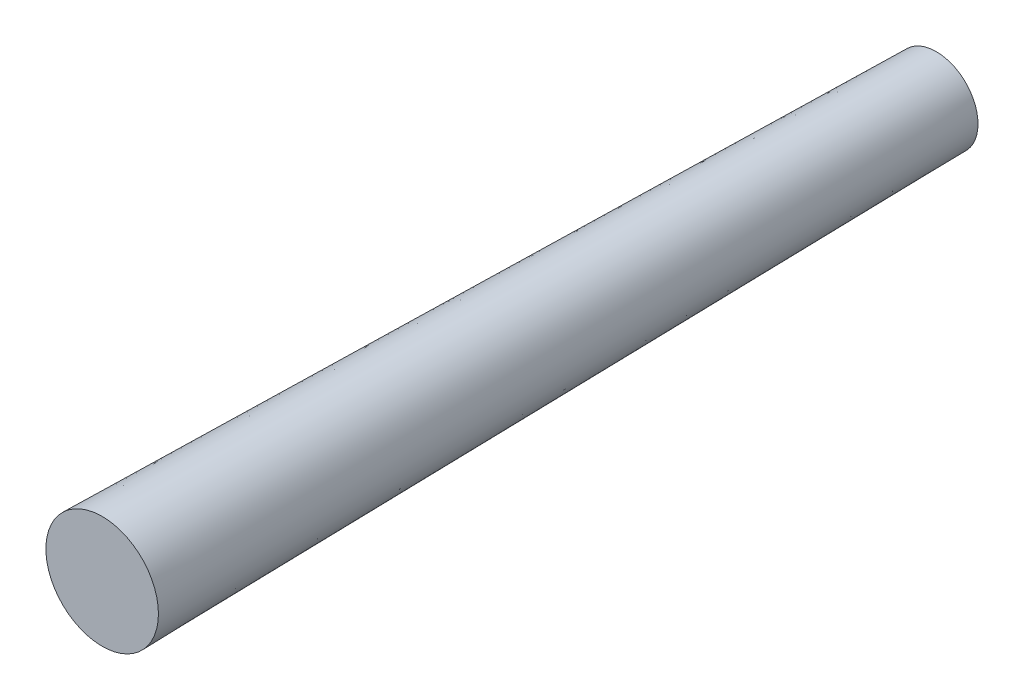
ISO-10303-21;
HEADER;
FILE_DESCRIPTION(('STEP AP214'),'2;1');
FILE_NAME('part.step','',(''),(''),'','','');
FILE_SCHEMA(('AUTOMOTIVE_DESIGN { 1 0 10303 214 1 1 1 1 }'));
ENDSEC;
DATA;
#1=APPLICATION_CONTEXT('core data for automotive mechanical design processes');
#2=APPLICATION_PROTOCOL_DEFINITION('international standard','automotive_design',2000,#1);
#3=PRODUCT_CONTEXT('',#1,'mechanical');
#4=PRODUCT('Part','Part','',(#3));
#5=PRODUCT_RELATED_PRODUCT_CATEGORY('part','',(#4));
#6=PRODUCT_DEFINITION_FORMATION('','',#4);
#7=PRODUCT_DEFINITION_CONTEXT('part definition',#1,'design');
#8=PRODUCT_DEFINITION('design','',#6,#7);
#9=PRODUCT_DEFINITION_SHAPE('','',#8);
#10=(LENGTH_UNIT() NAMED_UNIT(*) SI_UNIT(.MILLI.,.METRE.));
#11=(NAMED_UNIT(*) PLANE_ANGLE_UNIT() SI_UNIT($,.RADIAN.));
#12=(NAMED_UNIT(*) SI_UNIT($,.STERADIAN.) SOLID_ANGLE_UNIT());
#13=UNCERTAINTY_MEASURE_WITH_UNIT(LENGTH_MEASURE(1.E-05),#10,'distance_accuracy_value','');
#14=(GEOMETRIC_REPRESENTATION_CONTEXT(3) GLOBAL_UNCERTAINTY_ASSIGNED_CONTEXT((#13)) GLOBAL_UNIT_ASSIGNED_CONTEXT((#10,
#11,#12)) REPRESENTATION_CONTEXT('',''));
#15=CARTESIAN_POINT('',(0.,0.,0.));
#16=DIRECTION('',(0.,0.,1.));
#17=DIRECTION('',(1.,0.,0.));
#18=AXIS2_PLACEMENT_3D('',#15,#16,#17);
#19=CARTESIAN_POINT('',(0.,0.,0.));
#20=DIRECTION('',(0.,0.,1.));
#21=DIRECTION('',(1.,0.,0.));
#22=AXIS2_PLACEMENT_3D('',#19,#20,#21);
#23=CONICAL_SURFACE('',#22,3.,0.0174532925199433);
#24=CARTESIAN_POINT('',(0.,0.,60.));
#25=DIRECTION('',(0.,0.,1.));
#26=DIRECTION('',(1.,0.,0.));
#27=AXIS2_PLACEMENT_3D('',#24,#25,#26);
#28=CIRCLE('',#27,4.04730389569306);
#29=CARTESIAN_POINT('',(4.04730389569306,0.,60.));
#30=VERTEX_POINT('',#29);
#31=EDGE_CURVE('E10',#30,#30,#28,.T.);
#32=ORIENTED_EDGE('',*,*,#31,.F.);
#33=EDGE_LOOP('',(#32));
#34=FACE_BOUND('',#33,.T.);
#35=CARTESIAN_POINT('',(0.,0.,0.));
#36=DIRECTION('',(0.,0.,1.));
#37=DIRECTION('',(1.,0.,0.));
#38=AXIS2_PLACEMENT_3D('',#35,#36,#37);
#39=CIRCLE('',#38,3.);
#40=CARTESIAN_POINT('',(3.,0.,0.));
#41=VERTEX_POINT('',#40);
#42=EDGE_CURVE('E41',#41,#41,#39,.T.);
#43=ORIENTED_EDGE('',*,*,#42,.T.);
#44=EDGE_LOOP('',(#43));
#45=FACE_BOUND('',#44,.T.);
#46=ADVANCED_FACE('F35',(#34,#45),#23,.T.);
#47=CARTESIAN_POINT('',(0.,0.,60.));
#48=DIRECTION('',(0.,0.,1.));
#49=DIRECTION('',(1.,0.,0.));
#50=AXIS2_PLACEMENT_3D('',#47,#48,#49);
#51=PLANE('',#50);
#52=ORIENTED_EDGE('',*,*,#31,.T.);
#53=EDGE_LOOP('',(#52));
#54=FACE_BOUND('',#53,.T.);
#55=ADVANCED_FACE('F50',(#54),#51,.T.);
#56=CARTESIAN_POINT('',(0.,0.,0.));
#57=DIRECTION('',(0.,0.,1.));
#58=DIRECTION('',(1.,0.,0.));
#59=AXIS2_PLACEMENT_3D('',#56,#57,#58);
#60=PLANE('',#59);
#61=ORIENTED_EDGE('',*,*,#42,.F.);
#62=EDGE_LOOP('',(#61));
#63=FACE_BOUND('',#62,.T.);
#64=ADVANCED_FACE('F48',(#63),#60,.F.);
#65=CLOSED_SHELL('',(#46,#55,#64));
#66=MANIFOLD_SOLID_BREP('B2',#65);
#67=ADVANCED_BREP_SHAPE_REPRESENTATION('',(#18,#66),#14);
#68=SHAPE_DEFINITION_REPRESENTATION(#9,#67);
ENDSEC;
END-ISO-10303-21;
